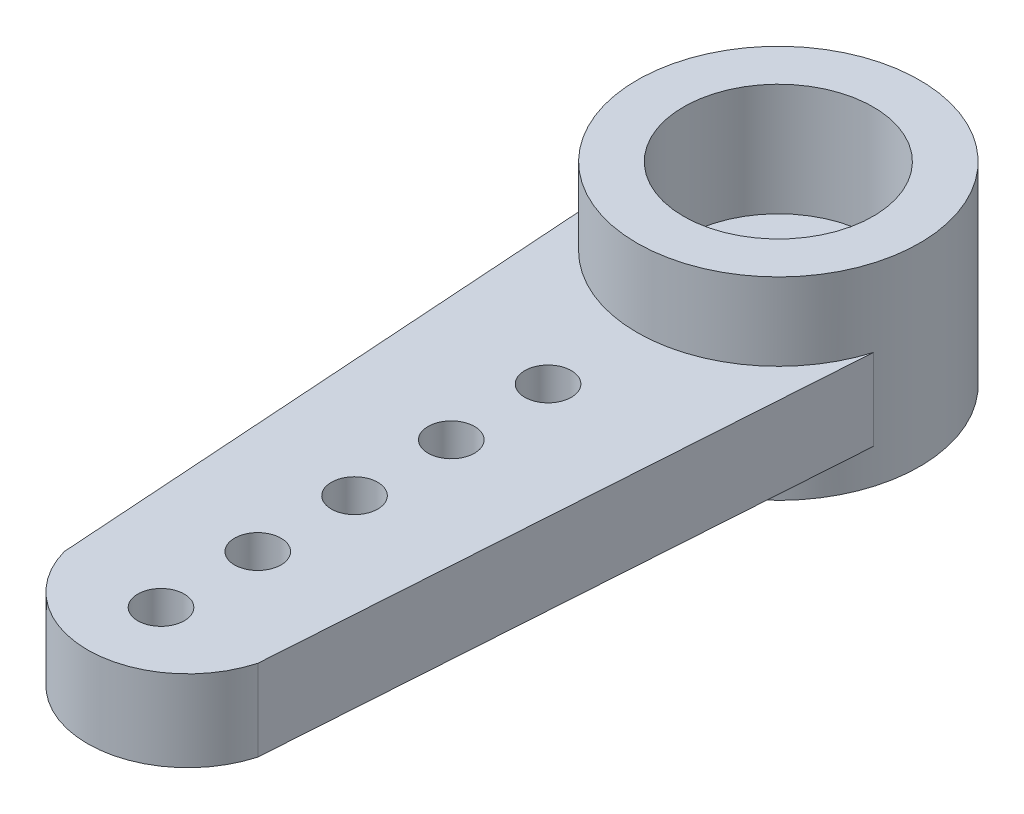
ISO-10303-21;
HEADER;
FILE_DESCRIPTION(('STEP AP214'),'2;1');
FILE_NAME('part.step','',(''),(''),'','','');
FILE_SCHEMA(('AUTOMOTIVE_DESIGN { 1 0 10303 214 1 1 1 1 }'));
ENDSEC;
DATA;
#1=APPLICATION_CONTEXT('core data for automotive mechanical design processes');
#2=APPLICATION_PROTOCOL_DEFINITION('international standard','automotive_design',2000,#1);
#3=PRODUCT_CONTEXT('',#1,'mechanical');
#4=PRODUCT('Part','Part','',(#3));
#5=PRODUCT_RELATED_PRODUCT_CATEGORY('part','',(#4));
#6=PRODUCT_DEFINITION_FORMATION('','',#4);
#7=PRODUCT_DEFINITION_CONTEXT('part definition',#1,'design');
#8=PRODUCT_DEFINITION('design','',#6,#7);
#9=PRODUCT_DEFINITION_SHAPE('','',#8);
#10=(LENGTH_UNIT() NAMED_UNIT(*) SI_UNIT(.MILLI.,.METRE.));
#11=(NAMED_UNIT(*) PLANE_ANGLE_UNIT() SI_UNIT($,.RADIAN.));
#12=(NAMED_UNIT(*) SI_UNIT($,.STERADIAN.) SOLID_ANGLE_UNIT());
#13=UNCERTAINTY_MEASURE_WITH_UNIT(LENGTH_MEASURE(1.E-05),#10,'distance_accuracy_value','');
#14=(GEOMETRIC_REPRESENTATION_CONTEXT(3) GLOBAL_UNCERTAINTY_ASSIGNED_CONTEXT((#13)) GLOBAL_UNIT_ASSIGNED_CONTEXT((#10,
#11,#12)) REPRESENTATION_CONTEXT('',''));
#15=CARTESIAN_POINT('',(0.,0.,0.));
#16=DIRECTION('',(0.,0.,1.));
#17=DIRECTION('',(1.,0.,0.));
#18=AXIS2_PLACEMENT_3D('',#15,#16,#17);
#19=CARTESIAN_POINT('',(0.,2.5,0.));
#20=DIRECTION('',(0.,-1.,0.));
#21=DIRECTION('',(0.,0.,-1.));
#22=AXIS2_PLACEMENT_3D('',#19,#20,#21);
#23=CYLINDRICAL_SURFACE('',#22,3.65);
#24=DIRECTION('',(0.,1.,0.));
#25=VECTOR('',#24,1.);
#26=CARTESIAN_POINT('',(3.5,-1.6,1.0356157588604));
#27=LINE('',#26,#25);
#28=CARTESIAN_POINT('',(3.5,-1.6,1.0356157588604));
#29=VERTEX_POINT('',#28);
#30=CARTESIAN_POINT('',(3.5,0.5,1.0356157588604));
#31=VERTEX_POINT('',#30);
#32=EDGE_CURVE('E53',#29,#31,#27,.T.);
#33=ORIENTED_EDGE('',*,*,#32,.F.);
#34=CARTESIAN_POINT('',(0.,-1.6,0.));
#35=DIRECTION('',(0.,-1.,0.));
#36=DIRECTION('',(0.,0.,-1.));
#37=AXIS2_PLACEMENT_3D('',#34,#35,#36);
#38=CIRCLE('',#37,3.65);
#39=CARTESIAN_POINT('',(-3.5,-1.6,1.0356157588604));
#40=VERTEX_POINT('',#39);
#41=EDGE_CURVE('E57',#29,#40,#38,.T.);
#42=ORIENTED_EDGE('',*,*,#41,.T.);
#43=DIRECTION('',(0.,1.,0.));
#44=VECTOR('',#43,1.);
#45=CARTESIAN_POINT('',(-3.5,-1.6,1.0356157588604));
#46=LINE('',#45,#44);
#47=CARTESIAN_POINT('',(-3.5,0.5,1.0356157588604));
#48=VERTEX_POINT('',#47);
#49=EDGE_CURVE('E89',#40,#48,#46,.T.);
#50=ORIENTED_EDGE('',*,*,#49,.T.);
#51=CARTESIAN_POINT('',(0.,0.5,0.));
#52=DIRECTION('',(0.,-1.,0.));
#53=DIRECTION('',(0.,0.,-1.));
#54=AXIS2_PLACEMENT_3D('',#51,#52,#53);
#55=CIRCLE('',#54,3.65);
#56=EDGE_CURVE('E105',#31,#48,#55,.T.);
#57=ORIENTED_EDGE('',*,*,#56,.F.);
#58=EDGE_LOOP('',(#33,#42,#50,#57));
#59=FACE_BOUND('',#58,.T.);
#60=CARTESIAN_POINT('',(0.,2.5,0.));
#61=DIRECTION('',(0.,1.,0.));
#62=DIRECTION('',(0.,0.,1.));
#63=AXIS2_PLACEMENT_3D('',#60,#61,#62);
#64=CIRCLE('',#63,3.65);
#65=CARTESIAN_POINT('',(0.,2.5,3.65));
#66=VERTEX_POINT('',#65);
#67=EDGE_CURVE('E11',#66,#66,#64,.T.);
#68=ORIENTED_EDGE('',*,*,#67,.F.);
#69=EDGE_LOOP('',(#68));
#70=FACE_BOUND('',#69,.T.);
#71=CARTESIAN_POINT('',(0.,-2.5,0.));
#72=DIRECTION('',(0.,1.,0.));
#73=DIRECTION('',(0.,0.,1.));
#74=AXIS2_PLACEMENT_3D('',#71,#72,#73);
#75=CIRCLE('',#74,3.65);
#76=CARTESIAN_POINT('',(0.,-2.5,3.65));
#77=VERTEX_POINT('',#76);
#78=EDGE_CURVE('E42',#77,#77,#75,.T.);
#79=ORIENTED_EDGE('',*,*,#78,.T.);
#80=EDGE_LOOP('',(#79));
#81=FACE_BOUND('',#80,.T.);
#82=ADVANCED_FACE('F39',(#59,#70,#81),#23,.T.);
#83=CARTESIAN_POINT('',(0.,2.5,0.));
#84=DIRECTION('',(0.,1.,0.));
#85=DIRECTION('',(0.,0.,1.));
#86=AXIS2_PLACEMENT_3D('',#83,#84,#85);
#87=PLANE('',#86);
#88=CARTESIAN_POINT('',(0.,2.5,0.));
#89=DIRECTION('',(0.,1.,0.));
#90=DIRECTION('',(0.,0.,1.));
#91=AXIS2_PLACEMENT_3D('',#88,#89,#90);
#92=CIRCLE('',#91,2.45);
#93=CARTESIAN_POINT('',(0.,2.5,2.45));
#94=VERTEX_POINT('',#93);
#95=EDGE_CURVE('E121',#94,#94,#92,.T.);
#96=ORIENTED_EDGE('',*,*,#95,.F.);
#97=EDGE_LOOP('',(#96));
#98=FACE_BOUND('',#97,.T.);
#99=ORIENTED_EDGE('',*,*,#67,.T.);
#100=EDGE_LOOP('',(#99));
#101=FACE_BOUND('',#100,.T.);
#102=ADVANCED_FACE('F132',(#98,#101),#87,.T.);
#103=CARTESIAN_POINT('',(0.,-2.5,0.));
#104=DIRECTION('',(0.,1.,0.));
#105=DIRECTION('',(0.,0.,1.));
#106=AXIS2_PLACEMENT_3D('',#103,#104,#105);
#107=PLANE('',#106);
#108=CARTESIAN_POINT('',(0.,-2.5,0.));
#109=DIRECTION('',(0.,1.,0.));
#110=DIRECTION('',(0.,0.,1.));
#111=AXIS2_PLACEMENT_3D('',#108,#109,#110);
#112=CIRCLE('',#111,1.3);
#113=CARTESIAN_POINT('',(0.,-2.5,1.3));
#114=VERTEX_POINT('',#113);
#115=EDGE_CURVE('E118',#114,#114,#112,.T.);
#116=ORIENTED_EDGE('',*,*,#115,.T.);
#117=EDGE_LOOP('',(#116));
#118=FACE_BOUND('',#117,.T.);
#119=ORIENTED_EDGE('',*,*,#78,.F.);
#120=EDGE_LOOP('',(#119));
#121=FACE_BOUND('',#120,.T.);
#122=ADVANCED_FACE('F135',(#118,#121),#107,.F.);
#123=CARTESIAN_POINT('',(0.,-0.4,0.));
#124=DIRECTION('',(0.,1.,0.));
#125=DIRECTION('',(0.,0.,1.));
#126=AXIS2_PLACEMENT_3D('',#123,#124,#125);
#127=CYLINDRICAL_SURFACE('',#126,2.45);
#128=CARTESIAN_POINT('',(0.,-0.4,0.));
#129=DIRECTION('',(0.,1.,0.));
#130=DIRECTION('',(0.,0.,1.));
#131=AXIS2_PLACEMENT_3D('',#128,#129,#130);
#132=CIRCLE('',#131,2.45);
#133=CARTESIAN_POINT('',(0.,-0.4,2.45));
#134=VERTEX_POINT('',#133);
#135=EDGE_CURVE('E124',#134,#134,#132,.T.);
#136=ORIENTED_EDGE('',*,*,#135,.F.);
#137=EDGE_LOOP('',(#136));
#138=FACE_BOUND('',#137,.T.);
#139=ORIENTED_EDGE('',*,*,#95,.T.);
#140=EDGE_LOOP('',(#139));
#141=FACE_BOUND('',#140,.T.);
#142=ADVANCED_FACE('F130',(#138,#141),#127,.F.);
#143=CARTESIAN_POINT('',(0.,-0.4,0.));
#144=DIRECTION('',(0.,1.,0.));
#145=DIRECTION('',(0.,0.,1.));
#146=AXIS2_PLACEMENT_3D('',#143,#144,#145);
#147=PLANE('',#146);
#148=CARTESIAN_POINT('',(0.,-0.4,0.));
#149=DIRECTION('',(0.,1.,0.));
#150=DIRECTION('',(0.,0.,1.));
#151=AXIS2_PLACEMENT_3D('',#148,#149,#150);
#152=CIRCLE('',#151,1.3);
#153=CARTESIAN_POINT('',(0.,-0.4,1.3));
#154=VERTEX_POINT('',#153);
#155=EDGE_CURVE('E115',#154,#154,#152,.T.);
#156=ORIENTED_EDGE('',*,*,#155,.F.);
#157=EDGE_LOOP('',(#156));
#158=FACE_BOUND('',#157,.T.);
#159=ORIENTED_EDGE('',*,*,#135,.T.);
#160=EDGE_LOOP('',(#159));
#161=FACE_BOUND('',#160,.T.);
#162=ADVANCED_FACE('F150',(#158,#161),#147,.T.);
#163=CARTESIAN_POINT('',(0.,-2.5,0.));
#164=DIRECTION('',(0.,1.,0.));
#165=DIRECTION('',(0.,0.,1.));
#166=AXIS2_PLACEMENT_3D('',#163,#164,#165);
#167=CYLINDRICAL_SURFACE('',#166,1.3);
#168=ORIENTED_EDGE('',*,*,#115,.F.);
#169=EDGE_LOOP('',(#168));
#170=FACE_BOUND('',#169,.T.);
#171=ORIENTED_EDGE('',*,*,#155,.T.);
#172=EDGE_LOOP('',(#171));
#173=FACE_BOUND('',#172,.T.);
#174=ADVANCED_FACE('F155',(#170,#173),#167,.F.);
#175=CARTESIAN_POINT('',(3.5,-1.6,1.0356157588604));
#176=DIRECTION('',(0.997759741977651,0.,0.0668991576082266));
#177=DIRECTION('',(0.0668991576082266,0.,-0.997759741977651));
#178=AXIS2_PLACEMENT_3D('',#175,#176,#177);
#179=PLANE('',#178);
#180=DIRECTION('',(0.0668991576082266,0.,-0.997759741977651));
#181=VECTOR('',#180,1.);
#182=CARTESIAN_POINT('',(3.5,0.5,1.0356157588604));
#183=LINE('',#182,#181);
#184=CARTESIAN_POINT('',(2.5,0.5,15.95));
#185=VERTEX_POINT('',#184);
#186=EDGE_CURVE('E100',#185,#31,#183,.T.);
#187=ORIENTED_EDGE('',*,*,#186,.F.);
#188=DIRECTION('',(0.,1.,0.));
#189=VECTOR('',#188,1.);
#190=CARTESIAN_POINT('',(2.5,-1.6,15.95));
#191=LINE('',#190,#189);
#192=CARTESIAN_POINT('',(2.5,-1.6,15.95));
#193=VERTEX_POINT('',#192);
#194=EDGE_CURVE('E88',#193,#185,#191,.T.);
#195=ORIENTED_EDGE('',*,*,#194,.F.);
#196=DIRECTION('',(0.0668991576082266,0.,-0.997759741977651));
#197=VECTOR('',#196,1.);
#198=CARTESIAN_POINT('',(3.5,-1.6,1.0356157588604));
#199=LINE('',#198,#197);
#200=EDGE_CURVE('E96',#193,#29,#199,.T.);
#201=ORIENTED_EDGE('',*,*,#200,.T.);
#202=ORIENTED_EDGE('',*,*,#32,.T.);
#203=EDGE_LOOP('',(#187,#195,#201,#202));
#204=FACE_BOUND('',#203,.T.);
#205=ADVANCED_FACE('F159',(#204),#179,.T.);
#206=CARTESIAN_POINT('',(0.,-1.6,15.2552631578947));
#207=DIRECTION('',(0.,1.,0.));
#208=DIRECTION('',(0.,0.,1.));
#209=AXIS2_PLACEMENT_3D('',#206,#207,#208);
#210=CYLINDRICAL_SURFACE('',#209,2.59473684210526);
#211=CARTESIAN_POINT('',(0.,0.5,15.2552631578947));
#212=DIRECTION('',(0.,1.,0.));
#213=DIRECTION('',(0.,0.,-1.));
#214=AXIS2_PLACEMENT_3D('',#211,#212,#213);
#215=CIRCLE('',#214,2.59473684210526);
#216=CARTESIAN_POINT('',(-2.5,0.5,15.95));
#217=VERTEX_POINT('',#216);
#218=EDGE_CURVE('E83',#217,#185,#215,.T.);
#219=ORIENTED_EDGE('',*,*,#218,.F.);
#220=DIRECTION('',(0.,1.,0.));
#221=VECTOR('',#220,1.);
#222=CARTESIAN_POINT('',(-2.5,-1.6,15.95));
#223=LINE('',#222,#221);
#224=CARTESIAN_POINT('',(-2.5,-1.6,15.95));
#225=VERTEX_POINT('',#224);
#226=EDGE_CURVE('E77',#225,#217,#223,.T.);
#227=ORIENTED_EDGE('',*,*,#226,.F.);
#228=CARTESIAN_POINT('',(0.,-1.6,15.2552631578947));
#229=DIRECTION('',(0.,1.,0.));
#230=DIRECTION('',(0.,0.,-1.));
#231=AXIS2_PLACEMENT_3D('',#228,#229,#230);
#232=CIRCLE('',#231,2.59473684210526);
#233=EDGE_CURVE('E80',#225,#193,#232,.T.);
#234=ORIENTED_EDGE('',*,*,#233,.T.);
#235=ORIENTED_EDGE('',*,*,#194,.T.);
#236=EDGE_LOOP('',(#219,#227,#234,#235));
#237=FACE_BOUND('',#236,.T.);
#238=ADVANCED_FACE('F79',(#237),#210,.T.);
#239=CARTESIAN_POINT('',(-3.5,-1.6,1.0356157588604));
#240=DIRECTION('',(-0.997759741977651,0.,0.0668991576082269));
#241=DIRECTION('',(0.0668991576082269,0.,0.997759741977651));
#242=AXIS2_PLACEMENT_3D('',#239,#240,#241);
#243=PLANE('',#242);
#244=DIRECTION('',(0.0668991576082269,0.,0.997759741977651));
#245=VECTOR('',#244,1.);
#246=CARTESIAN_POINT('',(-3.5,0.5,1.0356157588604));
#247=LINE('',#246,#245);
#248=EDGE_CURVE('E108',#48,#217,#247,.T.);
#249=ORIENTED_EDGE('',*,*,#248,.F.);
#250=ORIENTED_EDGE('',*,*,#49,.F.);
#251=DIRECTION('',(0.0668991576082269,0.,0.997759741977651));
#252=VECTOR('',#251,1.);
#253=CARTESIAN_POINT('',(-3.5,-1.6,1.0356157588604));
#254=LINE('',#253,#252);
#255=EDGE_CURVE('E94',#40,#225,#254,.T.);
#256=ORIENTED_EDGE('',*,*,#255,.T.);
#257=ORIENTED_EDGE('',*,*,#226,.T.);
#258=EDGE_LOOP('',(#249,#250,#256,#257));
#259=FACE_BOUND('',#258,.T.);
#260=ADVANCED_FACE('F98',(#259),#243,.T.);
#261=CARTESIAN_POINT('',(0.,-1.6,0.));
#262=DIRECTION('',(0.,-1.,0.));
#263=DIRECTION('',(0.,0.,-1.));
#264=AXIS2_PLACEMENT_3D('',#261,#262,#263);
#265=PLANE('',#264);
#266=CARTESIAN_POINT('',(0.,-1.6,15.95));
#267=DIRECTION('',(0.,-1.,0.));
#268=DIRECTION('',(0.,0.,-1.));
#269=AXIS2_PLACEMENT_3D('',#266,#267,#268);
#270=CIRCLE('',#269,0.599999999999963);
#271=CARTESIAN_POINT('',(0.,-1.6,15.35));
#272=VERTEX_POINT('',#271);
#273=EDGE_CURVE('E109',#272,#272,#270,.T.);
#274=ORIENTED_EDGE('',*,*,#273,.F.);
#275=EDGE_LOOP('',(#274));
#276=FACE_BOUND('',#275,.T.);
#277=CARTESIAN_POINT('',(0.,-1.6,13.45));
#278=DIRECTION('',(0.,-1.,0.));
#279=DIRECTION('',(0.,0.,-1.));
#280=AXIS2_PLACEMENT_3D('',#277,#278,#279);
#281=CIRCLE('',#280,0.6);
#282=CARTESIAN_POINT('',(0.,-1.6,12.85));
#283=VERTEX_POINT('',#282);
#284=EDGE_CURVE('E225',#283,#283,#281,.T.);
#285=ORIENTED_EDGE('',*,*,#284,.F.);
#286=EDGE_LOOP('',(#285));
#287=FACE_BOUND('',#286,.T.);
#288=CARTESIAN_POINT('',(0.,-1.6,10.95));
#289=DIRECTION('',(0.,-1.,0.));
#290=DIRECTION('',(0.,0.,-1.));
#291=AXIS2_PLACEMENT_3D('',#288,#289,#290);
#292=CIRCLE('',#291,0.6);
#293=CARTESIAN_POINT('',(0.,-1.6,10.35));
#294=VERTEX_POINT('',#293);
#295=EDGE_CURVE('E222',#294,#294,#292,.T.);
#296=ORIENTED_EDGE('',*,*,#295,.F.);
#297=EDGE_LOOP('',(#296));
#298=FACE_BOUND('',#297,.T.);
#299=CARTESIAN_POINT('',(0.,-1.6,8.45));
#300=DIRECTION('',(0.,-1.,0.));
#301=DIRECTION('',(0.,0.,-1.));
#302=AXIS2_PLACEMENT_3D('',#299,#300,#301);
#303=CIRCLE('',#302,0.6);
#304=CARTESIAN_POINT('',(0.,-1.6,7.85));
#305=VERTEX_POINT('',#304);
#306=EDGE_CURVE('E206',#305,#305,#303,.T.);
#307=ORIENTED_EDGE('',*,*,#306,.F.);
#308=EDGE_LOOP('',(#307));
#309=FACE_BOUND('',#308,.T.);
#310=CARTESIAN_POINT('',(0.,-1.6,5.95));
#311=DIRECTION('',(0.,-1.,0.));
#312=DIRECTION('',(0.,0.,-1.));
#313=AXIS2_PLACEMENT_3D('',#310,#311,#312);
#314=CIRCLE('',#313,0.6);
#315=CARTESIAN_POINT('',(0.,-1.6,5.35));
#316=VERTEX_POINT('',#315);
#317=EDGE_CURVE('E202',#316,#316,#314,.T.);
#318=ORIENTED_EDGE('',*,*,#317,.F.);
#319=EDGE_LOOP('',(#318));
#320=FACE_BOUND('',#319,.T.);
#321=ORIENTED_EDGE('',*,*,#41,.F.);
#322=ORIENTED_EDGE('',*,*,#200,.F.);
#323=ORIENTED_EDGE('',*,*,#233,.F.);
#324=ORIENTED_EDGE('',*,*,#255,.F.);
#325=EDGE_LOOP('',(#321,#322,#323,#324));
#326=FACE_BOUND('',#325,.T.);
#327=ADVANCED_FACE('F93',(#276,#287,#298,#309,#320,#326),#265,.T.);
#328=CARTESIAN_POINT('',(0.,0.5,0.));
#329=DIRECTION('',(0.,-1.,0.));
#330=DIRECTION('',(0.,0.,-1.));
#331=AXIS2_PLACEMENT_3D('',#328,#329,#330);
#332=PLANE('',#331);
#333=CARTESIAN_POINT('',(0.,0.5,15.95));
#334=DIRECTION('',(0.,1.,0.));
#335=DIRECTION('',(0.,0.,1.));
#336=AXIS2_PLACEMENT_3D('',#333,#334,#335);
#337=CIRCLE('',#336,0.599999999999963);
#338=CARTESIAN_POINT('',(0.,0.5,16.55));
#339=VERTEX_POINT('',#338);
#340=EDGE_CURVE('E201',#339,#339,#337,.T.);
#341=ORIENTED_EDGE('',*,*,#340,.F.);
#342=EDGE_LOOP('',(#341));
#343=FACE_BOUND('',#342,.T.);
#344=CARTESIAN_POINT('',(0.,0.5,13.45));
#345=DIRECTION('',(0.,1.,0.));
#346=DIRECTION('',(0.,0.,1.));
#347=AXIS2_PLACEMENT_3D('',#344,#345,#346);
#348=CIRCLE('',#347,0.6);
#349=CARTESIAN_POINT('',(0.,0.5,14.05));
#350=VERTEX_POINT('',#349);
#351=EDGE_CURVE('E203',#350,#350,#348,.T.);
#352=ORIENTED_EDGE('',*,*,#351,.F.);
#353=EDGE_LOOP('',(#352));
#354=FACE_BOUND('',#353,.T.);
#355=CARTESIAN_POINT('',(0.,0.5,10.95));
#356=DIRECTION('',(0.,1.,0.));
#357=DIRECTION('',(0.,0.,1.));
#358=AXIS2_PLACEMENT_3D('',#355,#356,#357);
#359=CIRCLE('',#358,0.6);
#360=CARTESIAN_POINT('',(0.,0.5,11.55));
#361=VERTEX_POINT('',#360);
#362=EDGE_CURVE('E209',#361,#361,#359,.T.);
#363=ORIENTED_EDGE('',*,*,#362,.F.);
#364=EDGE_LOOP('',(#363));
#365=FACE_BOUND('',#364,.T.);
#366=CARTESIAN_POINT('',(0.,0.5,8.45));
#367=DIRECTION('',(0.,1.,0.));
#368=DIRECTION('',(0.,0.,1.));
#369=AXIS2_PLACEMENT_3D('',#366,#367,#368);
#370=CIRCLE('',#369,0.6);
#371=CARTESIAN_POINT('',(0.,0.5,9.05));
#372=VERTEX_POINT('',#371);
#373=EDGE_CURVE('E214',#372,#372,#370,.T.);
#374=ORIENTED_EDGE('',*,*,#373,.F.);
#375=EDGE_LOOP('',(#374));
#376=FACE_BOUND('',#375,.T.);
#377=CARTESIAN_POINT('',(0.,0.5,5.95));
#378=DIRECTION('',(0.,1.,0.));
#379=DIRECTION('',(0.,0.,1.));
#380=AXIS2_PLACEMENT_3D('',#377,#378,#379);
#381=CIRCLE('',#380,0.6);
#382=CARTESIAN_POINT('',(0.,0.5,6.55));
#383=VERTEX_POINT('',#382);
#384=EDGE_CURVE('E217',#383,#383,#381,.T.);
#385=ORIENTED_EDGE('',*,*,#384,.F.);
#386=EDGE_LOOP('',(#385));
#387=FACE_BOUND('',#386,.T.);
#388=ORIENTED_EDGE('',*,*,#56,.T.);
#389=ORIENTED_EDGE('',*,*,#248,.T.);
#390=ORIENTED_EDGE('',*,*,#218,.T.);
#391=ORIENTED_EDGE('',*,*,#186,.T.);
#392=EDGE_LOOP('',(#388,#389,#390,#391));
#393=FACE_BOUND('',#392,.T.);
#394=ADVANCED_FACE('F168',(#343,#354,#365,#376,#387,#393),#332,.F.);
#395=CARTESIAN_POINT('',(0.,-9.5,5.95));
#396=DIRECTION('',(0.,1.,0.));
#397=DIRECTION('',(0.,0.,1.));
#398=AXIS2_PLACEMENT_3D('',#395,#396,#397);
#399=CYLINDRICAL_SURFACE('',#398,0.6);
#400=ORIENTED_EDGE('',*,*,#317,.T.);
#401=EDGE_LOOP('',(#400));
#402=FACE_BOUND('',#401,.T.);
#403=ORIENTED_EDGE('',*,*,#384,.T.);
#404=EDGE_LOOP('',(#403));
#405=FACE_BOUND('',#404,.T.);
#406=ADVANCED_FACE('F171',(#402,#405),#399,.F.);
#407=CARTESIAN_POINT('',(0.,-9.5,8.45));
#408=DIRECTION('',(0.,1.,0.));
#409=DIRECTION('',(0.,0.,1.));
#410=AXIS2_PLACEMENT_3D('',#407,#408,#409);
#411=CYLINDRICAL_SURFACE('',#410,0.6);
#412=ORIENTED_EDGE('',*,*,#306,.T.);
#413=EDGE_LOOP('',(#412));
#414=FACE_BOUND('',#413,.T.);
#415=ORIENTED_EDGE('',*,*,#373,.T.);
#416=EDGE_LOOP('',(#415));
#417=FACE_BOUND('',#416,.T.);
#418=ADVANCED_FACE('F178',(#414,#417),#411,.F.);
#419=CARTESIAN_POINT('',(0.,-9.5,10.95));
#420=DIRECTION('',(0.,1.,0.));
#421=DIRECTION('',(0.,0.,1.));
#422=AXIS2_PLACEMENT_3D('',#419,#420,#421);
#423=CYLINDRICAL_SURFACE('',#422,0.6);
#424=ORIENTED_EDGE('',*,*,#295,.T.);
#425=EDGE_LOOP('',(#424));
#426=FACE_BOUND('',#425,.T.);
#427=ORIENTED_EDGE('',*,*,#362,.T.);
#428=EDGE_LOOP('',(#427));
#429=FACE_BOUND('',#428,.T.);
#430=ADVANCED_FACE('F182',(#426,#429),#423,.F.);
#431=CARTESIAN_POINT('',(0.,-9.5,13.45));
#432=DIRECTION('',(0.,1.,0.));
#433=DIRECTION('',(0.,0.,1.));
#434=AXIS2_PLACEMENT_3D('',#431,#432,#433);
#435=CYLINDRICAL_SURFACE('',#434,0.6);
#436=ORIENTED_EDGE('',*,*,#284,.T.);
#437=EDGE_LOOP('',(#436));
#438=FACE_BOUND('',#437,.T.);
#439=ORIENTED_EDGE('',*,*,#351,.T.);
#440=EDGE_LOOP('',(#439));
#441=FACE_BOUND('',#440,.T.);
#442=ADVANCED_FACE('F186',(#438,#441),#435,.F.);
#443=CARTESIAN_POINT('',(0.,-9.5,15.95));
#444=DIRECTION('',(0.,1.,0.));
#445=DIRECTION('',(0.,0.,1.));
#446=AXIS2_PLACEMENT_3D('',#443,#444,#445);
#447=CYLINDRICAL_SURFACE('',#446,0.599999999999963);
#448=ORIENTED_EDGE('',*,*,#273,.T.);
#449=EDGE_LOOP('',(#448));
#450=FACE_BOUND('',#449,.T.);
#451=ORIENTED_EDGE('',*,*,#340,.T.);
#452=EDGE_LOOP('',(#451));
#453=FACE_BOUND('',#452,.T.);
#454=ADVANCED_FACE('F190',(#450,#453),#447,.F.);
#455=CLOSED_SHELL('',(#82,#102,#122,#142,#162,#174,#205,#238,#260,#327,#394,#406,#418,#430,#442,#454));
#456=MANIFOLD_SOLID_BREP('B2',#455);
#457=ADVANCED_BREP_SHAPE_REPRESENTATION('',(#18,#456),#14);
#458=SHAPE_DEFINITION_REPRESENTATION(#9,#457);
ENDSEC;
END-ISO-10303-21;
